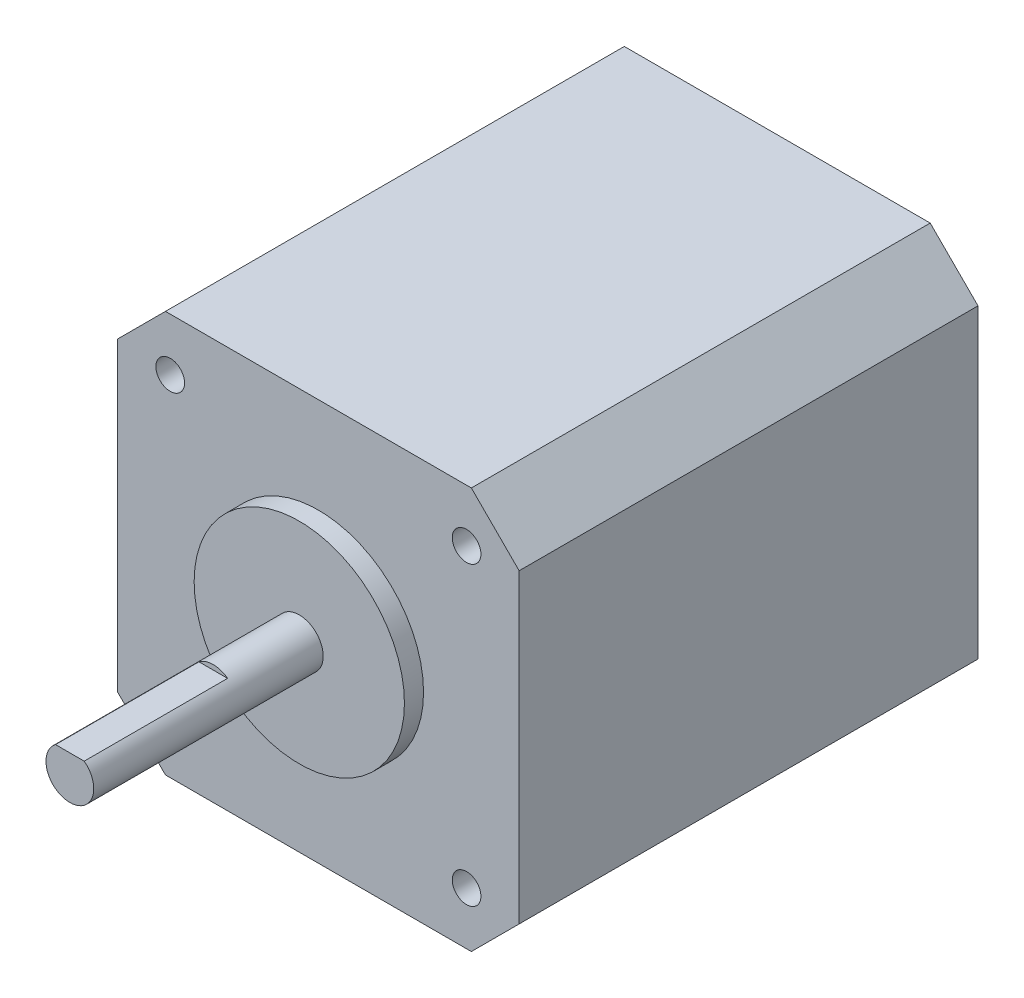
ISO-10303-21;
HEADER;
FILE_DESCRIPTION(('STEP AP214'),'2;1');
FILE_NAME('part.step','',(''),(''),'','','');
FILE_SCHEMA(('AUTOMOTIVE_DESIGN { 1 0 10303 214 1 1 1 1 }'));
ENDSEC;
DATA;
#1=APPLICATION_CONTEXT('core data for automotive mechanical design processes');
#2=APPLICATION_PROTOCOL_DEFINITION('international standard','automotive_design',2000,#1);
#3=PRODUCT_CONTEXT('',#1,'mechanical');
#4=PRODUCT('Part','Part','',(#3));
#5=PRODUCT_RELATED_PRODUCT_CATEGORY('part','',(#4));
#6=PRODUCT_DEFINITION_FORMATION('','',#4);
#7=PRODUCT_DEFINITION_CONTEXT('part definition',#1,'design');
#8=PRODUCT_DEFINITION('design','',#6,#7);
#9=PRODUCT_DEFINITION_SHAPE('','',#8);
#10=(LENGTH_UNIT() NAMED_UNIT(*) SI_UNIT(.MILLI.,.METRE.));
#11=(NAMED_UNIT(*) PLANE_ANGLE_UNIT() SI_UNIT($,.RADIAN.));
#12=(NAMED_UNIT(*) SI_UNIT($,.STERADIAN.) SOLID_ANGLE_UNIT());
#13=UNCERTAINTY_MEASURE_WITH_UNIT(LENGTH_MEASURE(1.E-05),#10,'distance_accuracy_value','');
#14=(GEOMETRIC_REPRESENTATION_CONTEXT(3) GLOBAL_UNCERTAINTY_ASSIGNED_CONTEXT((#13)) GLOBAL_UNIT_ASSIGNED_CONTEXT((#10,
#11,#12)) REPRESENTATION_CONTEXT('',''));
#15=CARTESIAN_POINT('',(0.,0.,0.));
#16=DIRECTION('',(0.,0.,1.));
#17=DIRECTION('',(1.,0.,0.));
#18=AXIS2_PLACEMENT_3D('',#15,#16,#17);
#19=CARTESIAN_POINT('',(-18.5,-18.5,-48.));
#20=DIRECTION('',(0.707106781186547,0.707106781186547,0.));
#21=DIRECTION('',(-0.707106781186548,0.707106781186548,0.));
#22=AXIS2_PLACEMENT_3D('',#19,#20,#21);
#23=PLANE('',#22);
#24=DIRECTION('',(-0.707106781186548,0.707106781186548,0.));
#25=VECTOR('',#24,1.);
#26=CARTESIAN_POINT('',(-18.5,-18.5,0.));
#27=LINE('',#26,#25);
#28=CARTESIAN_POINT('',(-16.,-21.,0.));
#29=VERTEX_POINT('',#28);
#30=CARTESIAN_POINT('',(-21.,-16.,0.));
#31=VERTEX_POINT('',#30);
#32=EDGE_CURVE('E136',#29,#31,#27,.T.);
#33=ORIENTED_EDGE('',*,*,#32,.T.);
#34=DIRECTION('',(0.,0.,1.));
#35=VECTOR('',#34,1.);
#36=CARTESIAN_POINT('',(-21.,-16.,-48.));
#37=LINE('',#36,#35);
#38=CARTESIAN_POINT('',(-21.,-16.,-48.));
#39=VERTEX_POINT('',#38);
#40=EDGE_CURVE('E44',#39,#31,#37,.T.);
#41=ORIENTED_EDGE('',*,*,#40,.F.);
#42=DIRECTION('',(-0.707106781186548,0.707106781186548,0.));
#43=VECTOR('',#42,1.);
#44=CARTESIAN_POINT('',(-18.5,-18.5,-48.));
#45=LINE('',#44,#43);
#46=CARTESIAN_POINT('',(-16.,-21.,-48.));
#47=VERTEX_POINT('',#46);
#48=EDGE_CURVE('E154',#47,#39,#45,.T.);
#49=ORIENTED_EDGE('',*,*,#48,.F.);
#50=DIRECTION('',(0.,0.,1.));
#51=VECTOR('',#50,1.);
#52=CARTESIAN_POINT('',(-16.,-21.,-48.));
#53=LINE('',#52,#51);
#54=EDGE_CURVE('E38',#47,#29,#53,.T.);
#55=ORIENTED_EDGE('',*,*,#54,.T.);
#56=EDGE_LOOP('',(#33,#41,#49,#55));
#57=FACE_BOUND('',#56,.T.);
#58=ADVANCED_FACE('F35',(#57),#23,.F.);
#59=CARTESIAN_POINT('',(-21.,0.,-48.));
#60=DIRECTION('',(1.,0.,0.));
#61=DIRECTION('',(0.,0.,-1.));
#62=AXIS2_PLACEMENT_3D('',#59,#60,#61);
#63=PLANE('',#62);
#64=DIRECTION('',(0.,1.,0.));
#65=VECTOR('',#64,1.);
#66=CARTESIAN_POINT('',(-21.,0.,0.));
#67=LINE('',#66,#65);
#68=CARTESIAN_POINT('',(-21.,16.,0.));
#69=VERTEX_POINT('',#68);
#70=EDGE_CURVE('E89',#31,#69,#67,.T.);
#71=ORIENTED_EDGE('',*,*,#70,.T.);
#72=DIRECTION('',(0.,0.,1.));
#73=VECTOR('',#72,1.);
#74=CARTESIAN_POINT('',(-21.,16.,-48.));
#75=LINE('',#74,#73);
#76=CARTESIAN_POINT('',(-21.,16.,-48.));
#77=VERTEX_POINT('',#76);
#78=EDGE_CURVE('E82',#77,#69,#75,.T.);
#79=ORIENTED_EDGE('',*,*,#78,.F.);
#80=DIRECTION('',(0.,1.,0.));
#81=VECTOR('',#80,1.);
#82=CARTESIAN_POINT('',(-21.,0.,-48.));
#83=LINE('',#82,#81);
#84=EDGE_CURVE('E53',#39,#77,#83,.T.);
#85=ORIENTED_EDGE('',*,*,#84,.F.);
#86=ORIENTED_EDGE('',*,*,#40,.T.);
#87=EDGE_LOOP('',(#71,#79,#85,#86));
#88=FACE_BOUND('',#87,.T.);
#89=ADVANCED_FACE('F185',(#88),#63,.F.);
#90=CARTESIAN_POINT('',(-18.5,18.5,-48.));
#91=DIRECTION('',(-0.707106781186547,0.707106781186547,0.));
#92=DIRECTION('',(-0.707106781186548,-0.707106781186548,0.));
#93=AXIS2_PLACEMENT_3D('',#90,#91,#92);
#94=PLANE('',#93);
#95=DIRECTION('',(-0.707106781186548,-0.707106781186548,0.));
#96=VECTOR('',#95,1.);
#97=CARTESIAN_POINT('',(-18.5,18.5,0.));
#98=LINE('',#97,#96);
#99=CARTESIAN_POINT('',(-16.,21.,0.));
#100=VERTEX_POINT('',#99);
#101=EDGE_CURVE('E115',#100,#69,#98,.T.);
#102=ORIENTED_EDGE('',*,*,#101,.F.);
#103=DIRECTION('',(0.,0.,1.));
#104=VECTOR('',#103,1.);
#105=CARTESIAN_POINT('',(-16.,21.,-48.));
#106=LINE('',#105,#104);
#107=CARTESIAN_POINT('',(-16.,21.,-48.));
#108=VERTEX_POINT('',#107);
#109=EDGE_CURVE('E111',#108,#100,#106,.T.);
#110=ORIENTED_EDGE('',*,*,#109,.F.);
#111=DIRECTION('',(-0.707106781186548,-0.707106781186548,0.));
#112=VECTOR('',#111,1.);
#113=CARTESIAN_POINT('',(-18.5,18.5,-48.));
#114=LINE('',#113,#112);
#115=EDGE_CURVE('E114',#108,#77,#114,.T.);
#116=ORIENTED_EDGE('',*,*,#115,.T.);
#117=ORIENTED_EDGE('',*,*,#78,.T.);
#118=EDGE_LOOP('',(#102,#110,#116,#117));
#119=FACE_BOUND('',#118,.T.);
#120=ADVANCED_FACE('F113',(#119),#94,.T.);
#121=CARTESIAN_POINT('',(0.,21.,-48.));
#122=DIRECTION('',(0.,1.,0.));
#123=DIRECTION('',(-1.,0.,0.));
#124=AXIS2_PLACEMENT_3D('',#121,#122,#123);
#125=PLANE('',#124);
#126=DIRECTION('',(-1.,0.,0.));
#127=VECTOR('',#126,1.);
#128=CARTESIAN_POINT('',(0.,21.,0.));
#129=LINE('',#128,#127);
#130=CARTESIAN_POINT('',(16.,21.,0.));
#131=VERTEX_POINT('',#130);
#132=EDGE_CURVE('E150',#131,#100,#129,.T.);
#133=ORIENTED_EDGE('',*,*,#132,.F.);
#134=DIRECTION('',(0.,0.,1.));
#135=VECTOR('',#134,1.);
#136=CARTESIAN_POINT('',(16.,21.,-48.));
#137=LINE('',#136,#135);
#138=CARTESIAN_POINT('',(16.,21.,-48.));
#139=VERTEX_POINT('',#138);
#140=EDGE_CURVE('E120',#139,#131,#137,.T.);
#141=ORIENTED_EDGE('',*,*,#140,.F.);
#142=DIRECTION('',(-1.,0.,0.));
#143=VECTOR('',#142,1.);
#144=CARTESIAN_POINT('',(0.,21.,-48.));
#145=LINE('',#144,#143);
#146=EDGE_CURVE('E125',#139,#108,#145,.T.);
#147=ORIENTED_EDGE('',*,*,#146,.T.);
#148=ORIENTED_EDGE('',*,*,#109,.T.);
#149=EDGE_LOOP('',(#133,#141,#147,#148));
#150=FACE_BOUND('',#149,.T.);
#151=ADVANCED_FACE('F128',(#150),#125,.T.);
#152=CARTESIAN_POINT('',(18.5,18.5,-48.));
#153=DIRECTION('',(0.707106781186547,0.707106781186547,0.));
#154=DIRECTION('',(-0.707106781186548,0.707106781186548,0.));
#155=AXIS2_PLACEMENT_3D('',#152,#153,#154);
#156=PLANE('',#155);
#157=DIRECTION('',(-0.707106781186548,0.707106781186548,0.));
#158=VECTOR('',#157,1.);
#159=CARTESIAN_POINT('',(18.5,18.5,0.));
#160=LINE('',#159,#158);
#161=CARTESIAN_POINT('',(21.,16.,0.));
#162=VERTEX_POINT('',#161);
#163=EDGE_CURVE('E147',#162,#131,#160,.T.);
#164=ORIENTED_EDGE('',*,*,#163,.F.);
#165=DIRECTION('',(0.,0.,1.));
#166=VECTOR('',#165,1.);
#167=CARTESIAN_POINT('',(21.,16.,-48.));
#168=LINE('',#167,#166);
#169=CARTESIAN_POINT('',(21.,16.,-48.));
#170=VERTEX_POINT('',#169);
#171=EDGE_CURVE('E158',#170,#162,#168,.T.);
#172=ORIENTED_EDGE('',*,*,#171,.F.);
#173=DIRECTION('',(-0.707106781186548,0.707106781186548,0.));
#174=VECTOR('',#173,1.);
#175=CARTESIAN_POINT('',(18.5,18.5,-48.));
#176=LINE('',#175,#174);
#177=EDGE_CURVE('E129',#170,#139,#176,.T.);
#178=ORIENTED_EDGE('',*,*,#177,.T.);
#179=ORIENTED_EDGE('',*,*,#140,.T.);
#180=EDGE_LOOP('',(#164,#172,#178,#179));
#181=FACE_BOUND('',#180,.T.);
#182=ADVANCED_FACE('F198',(#181),#156,.T.);
#183=CARTESIAN_POINT('',(21.,0.,-48.));
#184=DIRECTION('',(1.,0.,0.));
#185=DIRECTION('',(0.,1.,0.));
#186=AXIS2_PLACEMENT_3D('',#183,#184,#185);
#187=PLANE('',#186);
#188=DIRECTION('',(0.,1.,0.));
#189=VECTOR('',#188,1.);
#190=CARTESIAN_POINT('',(21.,0.,0.));
#191=LINE('',#190,#189);
#192=CARTESIAN_POINT('',(21.,-16.,0.));
#193=VERTEX_POINT('',#192);
#194=EDGE_CURVE('E144',#193,#162,#191,.T.);
#195=ORIENTED_EDGE('',*,*,#194,.F.);
#196=DIRECTION('',(0.,0.,1.));
#197=VECTOR('',#196,1.);
#198=CARTESIAN_POINT('',(21.,-16.,-48.));
#199=LINE('',#198,#197);
#200=CARTESIAN_POINT('',(21.,-16.,-48.));
#201=VERTEX_POINT('',#200);
#202=EDGE_CURVE('E160',#201,#193,#199,.T.);
#203=ORIENTED_EDGE('',*,*,#202,.F.);
#204=DIRECTION('',(0.,1.,0.));
#205=VECTOR('',#204,1.);
#206=CARTESIAN_POINT('',(21.,0.,-48.));
#207=LINE('',#206,#205);
#208=EDGE_CURVE('E131',#201,#170,#207,.T.);
#209=ORIENTED_EDGE('',*,*,#208,.T.);
#210=ORIENTED_EDGE('',*,*,#171,.T.);
#211=EDGE_LOOP('',(#195,#203,#209,#210));
#212=FACE_BOUND('',#211,.T.);
#213=ADVANCED_FACE('F181',(#212),#187,.T.);
#214=CARTESIAN_POINT('',(18.5,-18.5,-48.));
#215=DIRECTION('',(-0.707106781186547,0.707106781186547,0.));
#216=DIRECTION('',(-0.707106781186548,-0.707106781186548,0.));
#217=AXIS2_PLACEMENT_3D('',#214,#215,#216);
#218=PLANE('',#217);
#219=DIRECTION('',(-0.707106781186548,-0.707106781186548,0.));
#220=VECTOR('',#219,1.);
#221=CARTESIAN_POINT('',(18.5,-18.5,0.));
#222=LINE('',#221,#220);
#223=CARTESIAN_POINT('',(16.,-21.,0.));
#224=VERTEX_POINT('',#223);
#225=EDGE_CURVE('E142',#193,#224,#222,.T.);
#226=ORIENTED_EDGE('',*,*,#225,.T.);
#227=DIRECTION('',(0.,0.,1.));
#228=VECTOR('',#227,1.);
#229=CARTESIAN_POINT('',(16.,-21.,-48.));
#230=LINE('',#229,#228);
#231=CARTESIAN_POINT('',(16.,-21.,-48.));
#232=VERTEX_POINT('',#231);
#233=EDGE_CURVE('E161',#232,#224,#230,.T.);
#234=ORIENTED_EDGE('',*,*,#233,.F.);
#235=DIRECTION('',(-0.707106781186548,-0.707106781186548,0.));
#236=VECTOR('',#235,1.);
#237=CARTESIAN_POINT('',(18.5,-18.5,-48.));
#238=LINE('',#237,#236);
#239=EDGE_CURVE('E210',#201,#232,#238,.T.);
#240=ORIENTED_EDGE('',*,*,#239,.F.);
#241=ORIENTED_EDGE('',*,*,#202,.T.);
#242=EDGE_LOOP('',(#226,#234,#240,#241));
#243=FACE_BOUND('',#242,.T.);
#244=ADVANCED_FACE('F175',(#243),#218,.F.);
#245=CARTESIAN_POINT('',(0.,-21.,-48.));
#246=DIRECTION('',(0.,1.,0.));
#247=DIRECTION('',(-1.,0.,0.));
#248=AXIS2_PLACEMENT_3D('',#245,#246,#247);
#249=PLANE('',#248);
#250=DIRECTION('',(-1.,0.,0.));
#251=VECTOR('',#250,1.);
#252=CARTESIAN_POINT('',(0.,-21.,0.));
#253=LINE('',#252,#251);
#254=EDGE_CURVE('E139',#224,#29,#253,.T.);
#255=ORIENTED_EDGE('',*,*,#254,.T.);
#256=ORIENTED_EDGE('',*,*,#54,.F.);
#257=DIRECTION('',(-1.,0.,0.));
#258=VECTOR('',#257,1.);
#259=CARTESIAN_POINT('',(0.,-21.,-48.));
#260=LINE('',#259,#258);
#261=EDGE_CURVE('E96',#232,#47,#260,.T.);
#262=ORIENTED_EDGE('',*,*,#261,.F.);
#263=ORIENTED_EDGE('',*,*,#233,.T.);
#264=EDGE_LOOP('',(#255,#256,#262,#263));
#265=FACE_BOUND('',#264,.T.);
#266=ADVANCED_FACE('F173',(#265),#249,.F.);
#267=CARTESIAN_POINT('',(0.,0.,-48.));
#268=DIRECTION('',(0.,0.,1.));
#269=DIRECTION('',(1.,0.,0.));
#270=AXIS2_PLACEMENT_3D('',#267,#268,#269);
#271=PLANE('',#270);
#272=ORIENTED_EDGE('',*,*,#48,.T.);
#273=ORIENTED_EDGE('',*,*,#84,.T.);
#274=ORIENTED_EDGE('',*,*,#115,.F.);
#275=ORIENTED_EDGE('',*,*,#146,.F.);
#276=ORIENTED_EDGE('',*,*,#177,.F.);
#277=ORIENTED_EDGE('',*,*,#208,.F.);
#278=ORIENTED_EDGE('',*,*,#239,.T.);
#279=ORIENTED_EDGE('',*,*,#261,.T.);
#280=EDGE_LOOP('',(#272,#273,#274,#275,#276,#277,#278,#279));
#281=FACE_BOUND('',#280,.T.);
#282=ADVANCED_FACE('F123',(#281),#271,.F.);
#283=CARTESIAN_POINT('',(0.,0.,0.));
#284=DIRECTION('',(0.,0.,1.));
#285=DIRECTION('',(1.,0.,0.));
#286=AXIS2_PLACEMENT_3D('',#283,#284,#285);
#287=PLANE('',#286);
#288=CARTESIAN_POINT('',(-15.5,-15.5,0.));
#289=DIRECTION('',(0.,0.,1.));
#290=DIRECTION('',(1.,0.,0.));
#291=AXIS2_PLACEMENT_3D('',#288,#289,#290);
#292=CIRCLE('',#291,1.5);
#293=CARTESIAN_POINT('',(-14.,-15.5,0.));
#294=VERTEX_POINT('',#293);
#295=EDGE_CURVE('E245',#294,#294,#292,.T.);
#296=ORIENTED_EDGE('',*,*,#295,.F.);
#297=EDGE_LOOP('',(#296));
#298=FACE_BOUND('',#297,.T.);
#299=CARTESIAN_POINT('',(15.5,-15.5,0.));
#300=DIRECTION('',(0.,0.,1.));
#301=DIRECTION('',(1.,0.,0.));
#302=AXIS2_PLACEMENT_3D('',#299,#300,#301);
#303=CIRCLE('',#302,1.5);
#304=CARTESIAN_POINT('',(17.,-15.5,0.));
#305=VERTEX_POINT('',#304);
#306=EDGE_CURVE('E251',#305,#305,#303,.T.);
#307=ORIENTED_EDGE('',*,*,#306,.F.);
#308=EDGE_LOOP('',(#307));
#309=FACE_BOUND('',#308,.T.);
#310=CARTESIAN_POINT('',(15.5,15.5,0.));
#311=DIRECTION('',(0.,0.,1.));
#312=DIRECTION('',(1.,0.,0.));
#313=AXIS2_PLACEMENT_3D('',#310,#311,#312);
#314=CIRCLE('',#313,1.5);
#315=CARTESIAN_POINT('',(17.,15.5,0.));
#316=VERTEX_POINT('',#315);
#317=EDGE_CURVE('E257',#316,#316,#314,.T.);
#318=ORIENTED_EDGE('',*,*,#317,.F.);
#319=EDGE_LOOP('',(#318));
#320=FACE_BOUND('',#319,.T.);
#321=CARTESIAN_POINT('',(-15.5,15.5,0.));
#322=DIRECTION('',(0.,0.,1.));
#323=DIRECTION('',(1.,0.,0.));
#324=AXIS2_PLACEMENT_3D('',#321,#322,#323);
#325=CIRCLE('',#324,1.5);
#326=CARTESIAN_POINT('',(-14.,15.5,0.));
#327=VERTEX_POINT('',#326);
#328=EDGE_CURVE('E239',#327,#327,#325,.T.);
#329=ORIENTED_EDGE('',*,*,#328,.F.);
#330=EDGE_LOOP('',(#329));
#331=FACE_BOUND('',#330,.T.);
#332=CARTESIAN_POINT('',(0.,0.,0.));
#333=DIRECTION('',(0.,0.,1.));
#334=DIRECTION('',(1.,0.,0.));
#335=AXIS2_PLACEMENT_3D('',#332,#333,#334);
#336=CIRCLE('',#335,11.);
#337=CARTESIAN_POINT('',(11.,0.,0.));
#338=VERTEX_POINT('',#337);
#339=EDGE_CURVE('E11',#338,#338,#336,.T.);
#340=ORIENTED_EDGE('',*,*,#339,.F.);
#341=EDGE_LOOP('',(#340));
#342=FACE_BOUND('',#341,.T.);
#343=ORIENTED_EDGE('',*,*,#32,.F.);
#344=ORIENTED_EDGE('',*,*,#254,.F.);
#345=ORIENTED_EDGE('',*,*,#225,.F.);
#346=ORIENTED_EDGE('',*,*,#194,.T.);
#347=ORIENTED_EDGE('',*,*,#163,.T.);
#348=ORIENTED_EDGE('',*,*,#132,.T.);
#349=ORIENTED_EDGE('',*,*,#101,.T.);
#350=ORIENTED_EDGE('',*,*,#70,.F.);
#351=EDGE_LOOP('',(#343,#344,#345,#346,#347,#348,#349,#350));
#352=FACE_BOUND('',#351,.T.);
#353=ADVANCED_FACE('F170',(#298,#309,#320,#331,#342,#352),#287,.T.);
#354=CARTESIAN_POINT('',(0.,0.,2.));
#355=DIRECTION('',(0.,0.,-1.));
#356=DIRECTION('',(-1.,0.,0.));
#357=AXIS2_PLACEMENT_3D('',#354,#355,#356);
#358=CYLINDRICAL_SURFACE('',#357,11.);
#359=CARTESIAN_POINT('',(0.,0.,2.));
#360=DIRECTION('',(0.,0.,1.));
#361=DIRECTION('',(1.,0.,0.));
#362=AXIS2_PLACEMENT_3D('',#359,#360,#361);
#363=CIRCLE('',#362,11.);
#364=CARTESIAN_POINT('',(11.,0.,2.));
#365=VERTEX_POINT('',#364);
#366=EDGE_CURVE('E140',#365,#365,#363,.T.);
#367=ORIENTED_EDGE('',*,*,#366,.F.);
#368=EDGE_LOOP('',(#367));
#369=FACE_BOUND('',#368,.T.);
#370=ORIENTED_EDGE('',*,*,#339,.T.);
#371=EDGE_LOOP('',(#370));
#372=FACE_BOUND('',#371,.T.);
#373=ADVANCED_FACE('F274',(#369,#372),#358,.T.);
#374=CARTESIAN_POINT('',(0.,0.,2.));
#375=DIRECTION('',(0.,0.,1.));
#376=DIRECTION('',(1.,0.,0.));
#377=AXIS2_PLACEMENT_3D('',#374,#375,#376);
#378=PLANE('',#377);
#379=CARTESIAN_POINT('',(0.,0.,2.));
#380=DIRECTION('',(0.,0.,1.));
#381=DIRECTION('',(1.,0.,0.));
#382=AXIS2_PLACEMENT_3D('',#379,#380,#381);
#383=CIRCLE('',#382,2.5);
#384=CARTESIAN_POINT('',(2.49999999999999,0.,2.));
#385=VERTEX_POINT('',#384);
#386=EDGE_CURVE('E217',#385,#385,#383,.T.);
#387=ORIENTED_EDGE('',*,*,#386,.F.);
#388=EDGE_LOOP('',(#387));
#389=FACE_BOUND('',#388,.T.);
#390=ORIENTED_EDGE('',*,*,#366,.T.);
#391=EDGE_LOOP('',(#390));
#392=FACE_BOUND('',#391,.T.);
#393=ADVANCED_FACE('F281',(#389,#392),#378,.T.);
#394=CARTESIAN_POINT('',(0.,2.00000000000001,26.));
#395=DIRECTION('',(0.,1.,0.));
#396=DIRECTION('',(0.,0.,1.));
#397=AXIS2_PLACEMENT_3D('',#394,#395,#396);
#398=PLANE('',#397);
#399=DIRECTION('',(1.,0.,0.));
#400=VECTOR('',#399,1.);
#401=CARTESIAN_POINT('',(0.,2.00000000000001,11.));
#402=LINE('',#401,#400);
#403=CARTESIAN_POINT('',(-1.50000000000002,2.00000000000001,11.));
#404=VERTEX_POINT('',#403);
#405=CARTESIAN_POINT('',(1.49999999999998,2.00000000000001,11.));
#406=VERTEX_POINT('',#405);
#407=EDGE_CURVE('E235',#404,#406,#402,.T.);
#408=ORIENTED_EDGE('',*,*,#407,.F.);
#409=DIRECTION('',(0.,0.,-1.));
#410=VECTOR('',#409,1.);
#411=CARTESIAN_POINT('',(-1.50000000000002,2.00000000000001,26.));
#412=LINE('',#411,#410);
#413=CARTESIAN_POINT('',(-1.50000000000002,2.00000000000001,26.));
#414=VERTEX_POINT('',#413);
#415=EDGE_CURVE('E220',#414,#404,#412,.T.);
#416=ORIENTED_EDGE('',*,*,#415,.F.);
#417=DIRECTION('',(1.,0.,0.));
#418=VECTOR('',#417,1.);
#419=CARTESIAN_POINT('',(0.,2.00000000000001,26.));
#420=LINE('',#419,#418);
#421=CARTESIAN_POINT('',(1.49999999999998,2.00000000000001,26.));
#422=VERTEX_POINT('',#421);
#423=EDGE_CURVE('E229',#414,#422,#420,.T.);
#424=ORIENTED_EDGE('',*,*,#423,.T.);
#425=DIRECTION('',(0.,0.,-1.));
#426=VECTOR('',#425,1.);
#427=CARTESIAN_POINT('',(1.49999999999998,2.00000000000001,26.));
#428=LINE('',#427,#426);
#429=EDGE_CURVE('E223',#422,#406,#428,.T.);
#430=ORIENTED_EDGE('',*,*,#429,.T.);
#431=EDGE_LOOP('',(#408,#416,#424,#430));
#432=FACE_BOUND('',#431,.T.);
#433=ADVANCED_FACE('F287',(#432),#398,.T.);
#434=CARTESIAN_POINT('',(0.,0.,26.));
#435=DIRECTION('',(0.,0.,-1.));
#436=DIRECTION('',(-1.,0.,0.));
#437=AXIS2_PLACEMENT_3D('',#434,#435,#436);
#438=CYLINDRICAL_SURFACE('',#437,2.5);
#439=ORIENTED_EDGE('',*,*,#386,.T.);
#440=EDGE_LOOP('',(#439));
#441=FACE_BOUND('',#440,.T.);
#442=CARTESIAN_POINT('',(0.,0.,11.));
#443=DIRECTION('',(0.,0.,1.));
#444=DIRECTION('',(1.,0.,0.));
#445=AXIS2_PLACEMENT_3D('',#442,#443,#444);
#446=CIRCLE('',#445,2.5);
#447=EDGE_CURVE('E232',#406,#404,#446,.T.);
#448=ORIENTED_EDGE('',*,*,#447,.F.);
#449=ORIENTED_EDGE('',*,*,#429,.F.);
#450=CARTESIAN_POINT('',(0.,0.,26.));
#451=DIRECTION('',(0.,0.,1.));
#452=DIRECTION('',(1.,0.,0.));
#453=AXIS2_PLACEMENT_3D('',#450,#451,#452);
#454=CIRCLE('',#453,2.5);
#455=EDGE_CURVE('E226',#414,#422,#454,.T.);
#456=ORIENTED_EDGE('',*,*,#455,.F.);
#457=ORIENTED_EDGE('',*,*,#415,.T.);
#458=EDGE_LOOP('',(#448,#449,#456,#457));
#459=FACE_BOUND('',#458,.T.);
#460=ADVANCED_FACE('F294',(#441,#459),#438,.T.);
#461=CARTESIAN_POINT('',(0.,0.,26.));
#462=DIRECTION('',(0.,0.,1.));
#463=DIRECTION('',(1.,0.,0.));
#464=AXIS2_PLACEMENT_3D('',#461,#462,#463);
#465=PLANE('',#464);
#466=ORIENTED_EDGE('',*,*,#423,.F.);
#467=ORIENTED_EDGE('',*,*,#455,.T.);
#468=EDGE_LOOP('',(#466,#467));
#469=FACE_BOUND('',#468,.T.);
#470=ADVANCED_FACE('F298',(#469),#465,.T.);
#471=CARTESIAN_POINT('',(0.,0.,11.));
#472=DIRECTION('',(0.,0.,1.));
#473=DIRECTION('',(1.,0.,0.));
#474=AXIS2_PLACEMENT_3D('',#471,#472,#473);
#475=PLANE('',#474);
#476=ORIENTED_EDGE('',*,*,#407,.T.);
#477=ORIENTED_EDGE('',*,*,#447,.T.);
#478=EDGE_LOOP('',(#476,#477));
#479=FACE_BOUND('',#478,.T.);
#480=ADVANCED_FACE('F302',(#479),#475,.T.);
#481=CARTESIAN_POINT('',(-15.5,15.5,-5.));
#482=DIRECTION('',(0.,0.,1.));
#483=DIRECTION('',(1.,0.,0.));
#484=AXIS2_PLACEMENT_3D('',#481,#482,#483);
#485=CYLINDRICAL_SURFACE('',#484,1.5);
#486=CARTESIAN_POINT('',(-15.5,15.5,-5.));
#487=DIRECTION('',(0.,0.,1.));
#488=DIRECTION('',(1.,0.,0.));
#489=AXIS2_PLACEMENT_3D('',#486,#487,#488);
#490=CIRCLE('',#489,1.5);
#491=CARTESIAN_POINT('',(-14.,15.5,-5.));
#492=VERTEX_POINT('',#491);
#493=EDGE_CURVE('E238',#492,#492,#490,.T.);
#494=ORIENTED_EDGE('',*,*,#493,.F.);
#495=EDGE_LOOP('',(#494));
#496=FACE_BOUND('',#495,.T.);
#497=ORIENTED_EDGE('',*,*,#328,.T.);
#498=EDGE_LOOP('',(#497));
#499=FACE_BOUND('',#498,.T.);
#500=ADVANCED_FACE('F306',(#496,#499),#485,.F.);
#501=CARTESIAN_POINT('',(0.,0.,-5.));
#502=DIRECTION('',(0.,0.,1.));
#503=DIRECTION('',(1.,0.,0.));
#504=AXIS2_PLACEMENT_3D('',#501,#502,#503);
#505=PLANE('',#504);
#506=ORIENTED_EDGE('',*,*,#493,.T.);
#507=EDGE_LOOP('',(#506));
#508=FACE_BOUND('',#507,.T.);
#509=ADVANCED_FACE('F268',(#508),#505,.T.);
#510=CARTESIAN_POINT('',(15.5,15.5,-5.));
#511=DIRECTION('',(0.,0.,1.));
#512=DIRECTION('',(1.,0.,0.));
#513=AXIS2_PLACEMENT_3D('',#510,#511,#512);
#514=CYLINDRICAL_SURFACE('',#513,1.5);
#515=CARTESIAN_POINT('',(15.5,15.5,-5.));
#516=DIRECTION('',(0.,0.,1.));
#517=DIRECTION('',(1.,0.,0.));
#518=AXIS2_PLACEMENT_3D('',#515,#516,#517);
#519=CIRCLE('',#518,1.5);
#520=CARTESIAN_POINT('',(17.,15.5,-5.));
#521=VERTEX_POINT('',#520);
#522=EDGE_CURVE('E242',#521,#521,#519,.T.);
#523=ORIENTED_EDGE('',*,*,#522,.F.);
#524=EDGE_LOOP('',(#523));
#525=FACE_BOUND('',#524,.T.);
#526=ORIENTED_EDGE('',*,*,#317,.T.);
#527=EDGE_LOOP('',(#526));
#528=FACE_BOUND('',#527,.T.);
#529=ADVANCED_FACE('F265',(#525,#528),#514,.F.);
#530=CARTESIAN_POINT('',(0.,0.,-5.));
#531=DIRECTION('',(0.,0.,1.));
#532=DIRECTION('',(1.,0.,0.));
#533=AXIS2_PLACEMENT_3D('',#530,#531,#532);
#534=PLANE('',#533);
#535=ORIENTED_EDGE('',*,*,#522,.T.);
#536=EDGE_LOOP('',(#535));
#537=FACE_BOUND('',#536,.T.);
#538=ADVANCED_FACE('F263',(#537),#534,.T.);
#539=CARTESIAN_POINT('',(15.5,-15.5,-5.));
#540=DIRECTION('',(0.,0.,1.));
#541=DIRECTION('',(1.,0.,0.));
#542=AXIS2_PLACEMENT_3D('',#539,#540,#541);
#543=CYLINDRICAL_SURFACE('',#542,1.5);
#544=CARTESIAN_POINT('',(15.5,-15.5,-5.));
#545=DIRECTION('',(0.,0.,1.));
#546=DIRECTION('',(1.,0.,0.));
#547=AXIS2_PLACEMENT_3D('',#544,#545,#546);
#548=CIRCLE('',#547,1.5);
#549=CARTESIAN_POINT('',(17.,-15.5,-5.));
#550=VERTEX_POINT('',#549);
#551=EDGE_CURVE('E254',#550,#550,#548,.T.);
#552=ORIENTED_EDGE('',*,*,#551,.F.);
#553=EDGE_LOOP('',(#552));
#554=FACE_BOUND('',#553,.T.);
#555=ORIENTED_EDGE('',*,*,#306,.T.);
#556=EDGE_LOOP('',(#555));
#557=FACE_BOUND('',#556,.T.);
#558=ADVANCED_FACE('F323',(#554,#557),#543,.F.);
#559=CARTESIAN_POINT('',(0.,0.,-5.));
#560=DIRECTION('',(0.,0.,1.));
#561=DIRECTION('',(1.,0.,0.));
#562=AXIS2_PLACEMENT_3D('',#559,#560,#561);
#563=PLANE('',#562);
#564=ORIENTED_EDGE('',*,*,#551,.T.);
#565=EDGE_LOOP('',(#564));
#566=FACE_BOUND('',#565,.T.);
#567=ADVANCED_FACE('F318',(#566),#563,.T.);
#568=CARTESIAN_POINT('',(-15.5,-15.5,-5.));
#569=DIRECTION('',(0.,0.,1.));
#570=DIRECTION('',(1.,0.,0.));
#571=AXIS2_PLACEMENT_3D('',#568,#569,#570);
#572=CYLINDRICAL_SURFACE('',#571,1.5);
#573=CARTESIAN_POINT('',(-15.5,-15.5,-5.));
#574=DIRECTION('',(0.,0.,1.));
#575=DIRECTION('',(1.,0.,0.));
#576=AXIS2_PLACEMENT_3D('',#573,#574,#575);
#577=CIRCLE('',#576,1.5);
#578=CARTESIAN_POINT('',(-14.,-15.5,-5.));
#579=VERTEX_POINT('',#578);
#580=EDGE_CURVE('E248',#579,#579,#577,.T.);
#581=ORIENTED_EDGE('',*,*,#580,.F.);
#582=EDGE_LOOP('',(#581));
#583=FACE_BOUND('',#582,.T.);
#584=ORIENTED_EDGE('',*,*,#295,.T.);
#585=EDGE_LOOP('',(#584));
#586=FACE_BOUND('',#585,.T.);
#587=ADVANCED_FACE('F314',(#583,#586),#572,.F.);
#588=CARTESIAN_POINT('',(0.,0.,-5.));
#589=DIRECTION('',(0.,0.,1.));
#590=DIRECTION('',(1.,0.,0.));
#591=AXIS2_PLACEMENT_3D('',#588,#589,#590);
#592=PLANE('',#591);
#593=ORIENTED_EDGE('',*,*,#580,.T.);
#594=EDGE_LOOP('',(#593));
#595=FACE_BOUND('',#594,.T.);
#596=ADVANCED_FACE('F317',(#595),#592,.T.);
#597=CLOSED_SHELL('',(#58,#89,#120,#151,#182,#213,#244,#266,#282,#353,#373,#393,#433,#460,#470,
#480,#500,#509,#529,#538,#558,#567,#587,#596));
#598=MANIFOLD_SOLID_BREP('B2',#597);
#599=ADVANCED_BREP_SHAPE_REPRESENTATION('',(#18,#598),#14);
#600=SHAPE_DEFINITION_REPRESENTATION(#9,#599);
ENDSEC;
END-ISO-10303-21;
